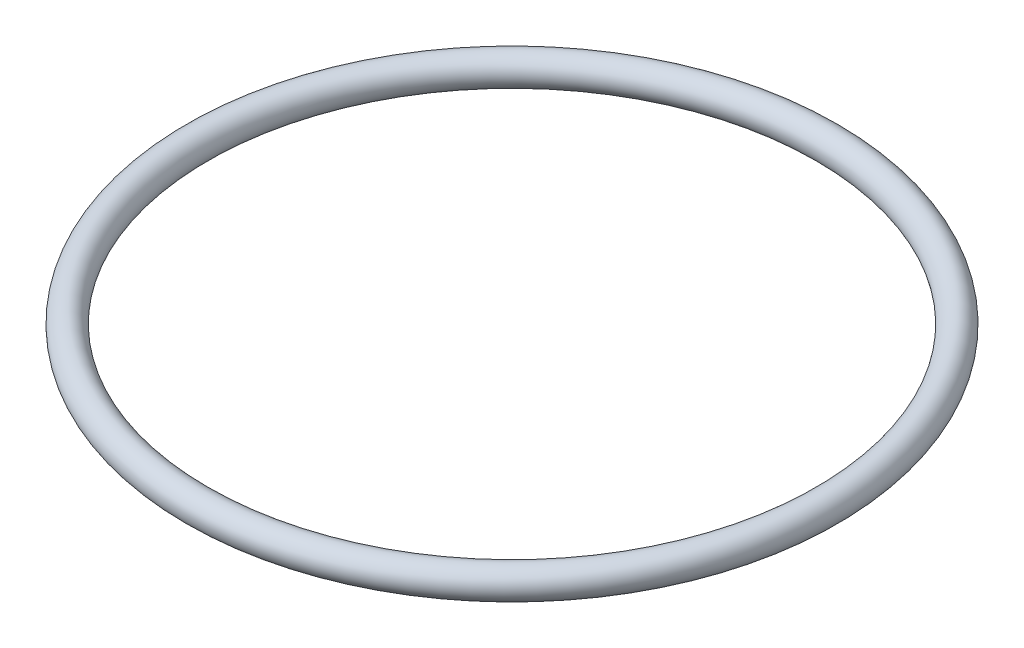
ISO-10303-21;
HEADER;
FILE_DESCRIPTION(('STEP AP214'),'2;1');
FILE_NAME('part.step','',(''),(''),'','','');
FILE_SCHEMA(('AUTOMOTIVE_DESIGN { 1 0 10303 214 1 1 1 1 }'));
ENDSEC;
DATA;
#1=APPLICATION_CONTEXT('core data for automotive mechanical design processes');
#2=APPLICATION_PROTOCOL_DEFINITION('international standard','automotive_design',2000,#1);
#3=PRODUCT_CONTEXT('',#1,'mechanical');
#4=PRODUCT('Part','Part','',(#3));
#5=PRODUCT_RELATED_PRODUCT_CATEGORY('part','',(#4));
#6=PRODUCT_DEFINITION_FORMATION('','',#4);
#7=PRODUCT_DEFINITION_CONTEXT('part definition',#1,'design');
#8=PRODUCT_DEFINITION('design','',#6,#7);
#9=PRODUCT_DEFINITION_SHAPE('','',#8);
#10=(LENGTH_UNIT() NAMED_UNIT(*) SI_UNIT(.MILLI.,.METRE.));
#11=(NAMED_UNIT(*) PLANE_ANGLE_UNIT() SI_UNIT($,.RADIAN.));
#12=(NAMED_UNIT(*) SI_UNIT($,.STERADIAN.) SOLID_ANGLE_UNIT());
#13=UNCERTAINTY_MEASURE_WITH_UNIT(LENGTH_MEASURE(1.E-05),#10,'distance_accuracy_value','');
#14=(GEOMETRIC_REPRESENTATION_CONTEXT(3) GLOBAL_UNCERTAINTY_ASSIGNED_CONTEXT((#13)) GLOBAL_UNIT_ASSIGNED_CONTEXT((#10,
#11,#12)) REPRESENTATION_CONTEXT('',''));
#15=CARTESIAN_POINT('',(0.,0.,0.));
#16=DIRECTION('',(0.,0.,1.));
#17=DIRECTION('',(1.,0.,0.));
#18=AXIS2_PLACEMENT_3D('',#15,#16,#17);
#19=CARTESIAN_POINT('',(0.,0.,0.));
#20=DIRECTION('',(0.,-1.,0.));
#21=DIRECTION('',(0.,0.,-1.));
#22=AXIS2_PLACEMENT_3D('',#19,#20,#21);
#23=TOROIDAL_SURFACE('',#22,21.,1.);
#24=CARTESIAN_POINT('',(0.,0.,-22.));
#25=VERTEX_POINT('',#24);
#26=VERTEX_LOOP('',#25);
#27=FACE_BOUND('',#26,.T.);
#28=ADVANCED_FACE('F34',(#27),#23,.T.);
#29=CLOSED_SHELL('',(#28));
#30=MANIFOLD_SOLID_BREP('B2',#29);
#31=ADVANCED_BREP_SHAPE_REPRESENTATION('',(#18,#30),#14);
#32=SHAPE_DEFINITION_REPRESENTATION(#9,#31);
ENDSEC;
END-ISO-10303-21;
